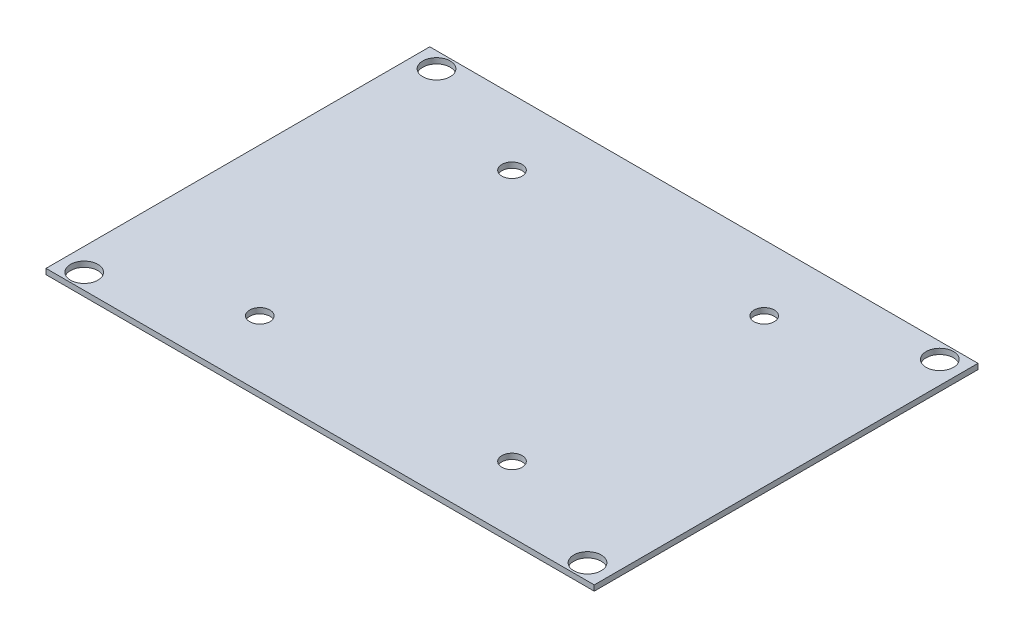
ISO-10303-21;
HEADER;
FILE_DESCRIPTION(('STEP AP214'),'2;1');
FILE_NAME('part.step','',(''),(''),'','','');
FILE_SCHEMA(('AUTOMOTIVE_DESIGN { 1 0 10303 214 1 1 1 1 }'));
ENDSEC;
DATA;
#1=APPLICATION_CONTEXT('core data for automotive mechanical design processes');
#2=APPLICATION_PROTOCOL_DEFINITION('international standard','automotive_design',2000,#1);
#3=PRODUCT_CONTEXT('',#1,'mechanical');
#4=PRODUCT('Part','Part','',(#3));
#5=PRODUCT_RELATED_PRODUCT_CATEGORY('part','',(#4));
#6=PRODUCT_DEFINITION_FORMATION('','',#4);
#7=PRODUCT_DEFINITION_CONTEXT('part definition',#1,'design');
#8=PRODUCT_DEFINITION('design','',#6,#7);
#9=PRODUCT_DEFINITION_SHAPE('','',#8);
#10=(LENGTH_UNIT() NAMED_UNIT(*) SI_UNIT(.MILLI.,.METRE.));
#11=(NAMED_UNIT(*) PLANE_ANGLE_UNIT() SI_UNIT($,.RADIAN.));
#12=(NAMED_UNIT(*) SI_UNIT($,.STERADIAN.) SOLID_ANGLE_UNIT());
#13=UNCERTAINTY_MEASURE_WITH_UNIT(LENGTH_MEASURE(1.E-05),#10,'distance_accuracy_value','');
#14=(GEOMETRIC_REPRESENTATION_CONTEXT(3) GLOBAL_UNCERTAINTY_ASSIGNED_CONTEXT((#13)) GLOBAL_UNIT_ASSIGNED_CONTEXT((#10,
#11,#12)) REPRESENTATION_CONTEXT('',''));
#15=CARTESIAN_POINT('',(0.,0.,0.));
#16=DIRECTION('',(0.,0.,1.));
#17=DIRECTION('',(1.,0.,0.));
#18=AXIS2_PLACEMENT_3D('',#15,#16,#17);
#19=CARTESIAN_POINT('',(0.,1.,0.));
#20=DIRECTION('',(0.,1.,0.));
#21=DIRECTION('',(0.,0.,1.));
#22=AXIS2_PLACEMENT_3D('',#19,#20,#21);
#23=PLANE('',#22);
#24=CARTESIAN_POINT('',(45.9038403974048,1.,32.1326882781834));
#25=DIRECTION('',(0.,1.,0.));
#26=DIRECTION('',(0.,0.,1.));
#27=AXIS2_PLACEMENT_3D('',#24,#25,#26);
#28=CIRCLE('',#27,2.5);
#29=CARTESIAN_POINT('',(45.9038403974048,1.,34.6326882781834));
#30=VERTEX_POINT('',#29);
#31=EDGE_CURVE('E174',#30,#30,#28,.T.);
#32=ORIENTED_EDGE('',*,*,#31,.F.);
#33=EDGE_LOOP('',(#32));
#34=FACE_BOUND('',#33,.T.);
#35=CARTESIAN_POINT('',(-45.9038403974048,1.,-32.1326882781834));
#36=DIRECTION('',(0.,1.,0.));
#37=DIRECTION('',(0.,0.,1.));
#38=AXIS2_PLACEMENT_3D('',#35,#36,#37);
#39=CIRCLE('',#38,2.5);
#40=CARTESIAN_POINT('',(-45.9038403974048,1.,-29.6326882781834));
#41=VERTEX_POINT('',#40);
#42=EDGE_CURVE('E158',#41,#41,#39,.T.);
#43=ORIENTED_EDGE('',*,*,#42,.F.);
#44=EDGE_LOOP('',(#43));
#45=FACE_BOUND('',#44,.T.);
#46=CARTESIAN_POINT('',(23.,1.,23.));
#47=DIRECTION('',(0.,1.,0.));
#48=DIRECTION('',(0.,0.,1.));
#49=AXIS2_PLACEMENT_3D('',#46,#47,#48);
#50=CIRCLE('',#49,1.85);
#51=CARTESIAN_POINT('',(23.,1.,24.85));
#52=VERTEX_POINT('',#51);
#53=EDGE_CURVE('E142',#52,#52,#50,.T.);
#54=ORIENTED_EDGE('',*,*,#53,.F.);
#55=EDGE_LOOP('',(#54));
#56=FACE_BOUND('',#55,.T.);
#57=CARTESIAN_POINT('',(-23.,1.,-23.));
#58=DIRECTION('',(0.,1.,0.));
#59=DIRECTION('',(0.,0.,1.));
#60=AXIS2_PLACEMENT_3D('',#57,#58,#59);
#61=CIRCLE('',#60,1.85);
#62=CARTESIAN_POINT('',(-23.,1.,-21.15));
#63=VERTEX_POINT('',#62);
#64=EDGE_CURVE('E112',#63,#63,#61,.T.);
#65=ORIENTED_EDGE('',*,*,#64,.F.);
#66=EDGE_LOOP('',(#65));
#67=FACE_BOUND('',#66,.T.);
#68=DIRECTION('',(0.,0.,-1.));
#69=VECTOR('',#68,1.);
#70=CARTESIAN_POINT('',(50.,1.,-35.));
#71=LINE('',#70,#69);
#72=CARTESIAN_POINT('',(50.,1.,35.));
#73=VERTEX_POINT('',#72);
#74=CARTESIAN_POINT('',(50.,1.,-35.));
#75=VERTEX_POINT('',#74);
#76=EDGE_CURVE('E92',#73,#75,#71,.T.);
#77=ORIENTED_EDGE('',*,*,#76,.T.);
#78=DIRECTION('',(-1.,0.,0.));
#79=VECTOR('',#78,1.);
#80=CARTESIAN_POINT('',(-50.,1.,-35.));
#81=LINE('',#80,#79);
#82=CARTESIAN_POINT('',(-50.,1.,-35.));
#83=VERTEX_POINT('',#82);
#84=EDGE_CURVE('E87',#75,#83,#81,.T.);
#85=ORIENTED_EDGE('',*,*,#84,.T.);
#86=DIRECTION('',(0.,0.,1.));
#87=VECTOR('',#86,1.);
#88=CARTESIAN_POINT('',(-50.,1.,-35.));
#89=LINE('',#88,#87);
#90=CARTESIAN_POINT('',(-50.,1.,35.));
#91=VERTEX_POINT('',#90);
#92=EDGE_CURVE('E90',#83,#91,#89,.T.);
#93=ORIENTED_EDGE('',*,*,#92,.T.);
#94=DIRECTION('',(1.,0.,0.));
#95=VECTOR('',#94,1.);
#96=CARTESIAN_POINT('',(-50.,1.,35.));
#97=LINE('',#96,#95);
#98=EDGE_CURVE('E57',#91,#73,#97,.T.);
#99=ORIENTED_EDGE('',*,*,#98,.T.);
#100=EDGE_LOOP('',(#77,#85,#93,#99));
#101=FACE_BOUND('',#100,.T.);
#102=CARTESIAN_POINT('',(-23.,1.,23.));
#103=DIRECTION('',(0.,1.,0.));
#104=DIRECTION('',(0.,0.,1.));
#105=AXIS2_PLACEMENT_3D('',#102,#103,#104);
#106=CIRCLE('',#105,1.85);
#107=CARTESIAN_POINT('',(-23.,1.,24.85));
#108=VERTEX_POINT('',#107);
#109=EDGE_CURVE('E134',#108,#108,#106,.T.);
#110=ORIENTED_EDGE('',*,*,#109,.F.);
#111=EDGE_LOOP('',(#110));
#112=FACE_BOUND('',#111,.T.);
#113=CARTESIAN_POINT('',(23.,1.,-23.));
#114=DIRECTION('',(0.,1.,0.));
#115=DIRECTION('',(0.,0.,1.));
#116=AXIS2_PLACEMENT_3D('',#113,#114,#115);
#117=CIRCLE('',#116,1.85);
#118=CARTESIAN_POINT('',(23.,1.,-21.15));
#119=VERTEX_POINT('',#118);
#120=EDGE_CURVE('E150',#119,#119,#117,.T.);
#121=ORIENTED_EDGE('',*,*,#120,.F.);
#122=EDGE_LOOP('',(#121));
#123=FACE_BOUND('',#122,.T.);
#124=CARTESIAN_POINT('',(45.9038403974048,1.,-32.1326882781834));
#125=DIRECTION('',(0.,1.,0.));
#126=DIRECTION('',(0.,0.,1.));
#127=AXIS2_PLACEMENT_3D('',#124,#125,#126);
#128=CIRCLE('',#127,2.5);
#129=CARTESIAN_POINT('',(45.9038403974048,1.,-29.6326882781834));
#130=VERTEX_POINT('',#129);
#131=EDGE_CURVE('E166',#130,#130,#128,.T.);
#132=ORIENTED_EDGE('',*,*,#131,.F.);
#133=EDGE_LOOP('',(#132));
#134=FACE_BOUND('',#133,.T.);
#135=CARTESIAN_POINT('',(-45.9038403974048,1.,32.1326882781834));
#136=DIRECTION('',(0.,1.,0.));
#137=DIRECTION('',(0.,0.,1.));
#138=AXIS2_PLACEMENT_3D('',#135,#136,#137);
#139=CIRCLE('',#138,2.5);
#140=CARTESIAN_POINT('',(-45.9038403974048,1.,34.6326882781834));
#141=VERTEX_POINT('',#140);
#142=EDGE_CURVE('E182',#141,#141,#139,.T.);
#143=ORIENTED_EDGE('',*,*,#142,.F.);
#144=EDGE_LOOP('',(#143));
#145=FACE_BOUND('',#144,.T.);
#146=ADVANCED_FACE('F39',(#34,#45,#56,#67,#101,#112,#123,#134,#145),#23,.T.);
#147=CARTESIAN_POINT('',(0.,0.,0.));
#148=DIRECTION('',(0.,1.,0.));
#149=DIRECTION('',(0.,0.,1.));
#150=AXIS2_PLACEMENT_3D('',#147,#148,#149);
#151=PLANE('',#150);
#152=DIRECTION('',(0.,0.,-1.));
#153=VECTOR('',#152,1.);
#154=CARTESIAN_POINT('',(50.,0.,-35.));
#155=LINE('',#154,#153);
#156=CARTESIAN_POINT('',(50.,0.,35.));
#157=VERTEX_POINT('',#156);
#158=CARTESIAN_POINT('',(50.,0.,-35.));
#159=VERTEX_POINT('',#158);
#160=EDGE_CURVE('E108',#157,#159,#155,.T.);
#161=ORIENTED_EDGE('',*,*,#160,.F.);
#162=DIRECTION('',(1.,0.,0.));
#163=VECTOR('',#162,1.);
#164=CARTESIAN_POINT('',(-50.,0.,35.));
#165=LINE('',#164,#163);
#166=CARTESIAN_POINT('',(-50.,0.,35.));
#167=VERTEX_POINT('',#166);
#168=EDGE_CURVE('E80',#167,#157,#165,.T.);
#169=ORIENTED_EDGE('',*,*,#168,.F.);
#170=DIRECTION('',(0.,0.,1.));
#171=VECTOR('',#170,1.);
#172=CARTESIAN_POINT('',(-50.,0.,-35.));
#173=LINE('',#172,#171);
#174=CARTESIAN_POINT('',(-50.,0.,-35.));
#175=VERTEX_POINT('',#174);
#176=EDGE_CURVE('E74',#175,#167,#173,.T.);
#177=ORIENTED_EDGE('',*,*,#176,.F.);
#178=DIRECTION('',(-1.,0.,0.));
#179=VECTOR('',#178,1.);
#180=CARTESIAN_POINT('',(-50.,0.,-35.));
#181=LINE('',#180,#179);
#182=EDGE_CURVE('E97',#159,#175,#181,.T.);
#183=ORIENTED_EDGE('',*,*,#182,.F.);
#184=EDGE_LOOP('',(#161,#169,#177,#183));
#185=FACE_BOUND('',#184,.T.);
#186=CARTESIAN_POINT('',(-23.,0.,-23.));
#187=DIRECTION('',(0.,1.,0.));
#188=DIRECTION('',(0.,0.,1.));
#189=AXIS2_PLACEMENT_3D('',#186,#187,#188);
#190=CIRCLE('',#189,1.85);
#191=CARTESIAN_POINT('',(-23.,0.,-21.15));
#192=VERTEX_POINT('',#191);
#193=EDGE_CURVE('E130',#192,#192,#190,.T.);
#194=ORIENTED_EDGE('',*,*,#193,.T.);
#195=EDGE_LOOP('',(#194));
#196=FACE_BOUND('',#195,.T.);
#197=CARTESIAN_POINT('',(-23.,0.,23.));
#198=DIRECTION('',(0.,1.,0.));
#199=DIRECTION('',(0.,0.,1.));
#200=AXIS2_PLACEMENT_3D('',#197,#198,#199);
#201=CIRCLE('',#200,1.85);
#202=CARTESIAN_POINT('',(-23.,0.,24.85));
#203=VERTEX_POINT('',#202);
#204=EDGE_CURVE('E138',#203,#203,#201,.T.);
#205=ORIENTED_EDGE('',*,*,#204,.T.);
#206=EDGE_LOOP('',(#205));
#207=FACE_BOUND('',#206,.T.);
#208=CARTESIAN_POINT('',(23.,0.,23.));
#209=DIRECTION('',(0.,1.,0.));
#210=DIRECTION('',(0.,0.,1.));
#211=AXIS2_PLACEMENT_3D('',#208,#209,#210);
#212=CIRCLE('',#211,1.85);
#213=CARTESIAN_POINT('',(23.,0.,24.85));
#214=VERTEX_POINT('',#213);
#215=EDGE_CURVE('E146',#214,#214,#212,.T.);
#216=ORIENTED_EDGE('',*,*,#215,.T.);
#217=EDGE_LOOP('',(#216));
#218=FACE_BOUND('',#217,.T.);
#219=CARTESIAN_POINT('',(23.,0.,-23.));
#220=DIRECTION('',(0.,1.,0.));
#221=DIRECTION('',(0.,0.,1.));
#222=AXIS2_PLACEMENT_3D('',#219,#220,#221);
#223=CIRCLE('',#222,1.85);
#224=CARTESIAN_POINT('',(23.,0.,-21.15));
#225=VERTEX_POINT('',#224);
#226=EDGE_CURVE('E154',#225,#225,#223,.T.);
#227=ORIENTED_EDGE('',*,*,#226,.T.);
#228=EDGE_LOOP('',(#227));
#229=FACE_BOUND('',#228,.T.);
#230=CARTESIAN_POINT('',(-45.9038403974048,0.,-32.1326882781834));
#231=DIRECTION('',(0.,1.,0.));
#232=DIRECTION('',(0.,0.,1.));
#233=AXIS2_PLACEMENT_3D('',#230,#231,#232);
#234=CIRCLE('',#233,2.5);
#235=CARTESIAN_POINT('',(-45.9038403974048,0.,-29.6326882781834));
#236=VERTEX_POINT('',#235);
#237=EDGE_CURVE('E162',#236,#236,#234,.T.);
#238=ORIENTED_EDGE('',*,*,#237,.T.);
#239=EDGE_LOOP('',(#238));
#240=FACE_BOUND('',#239,.T.);
#241=CARTESIAN_POINT('',(45.9038403974048,0.,-32.1326882781834));
#242=DIRECTION('',(0.,1.,0.));
#243=DIRECTION('',(0.,0.,1.));
#244=AXIS2_PLACEMENT_3D('',#241,#242,#243);
#245=CIRCLE('',#244,2.5);
#246=CARTESIAN_POINT('',(45.9038403974048,0.,-29.6326882781834));
#247=VERTEX_POINT('',#246);
#248=EDGE_CURVE('E170',#247,#247,#245,.T.);
#249=ORIENTED_EDGE('',*,*,#248,.T.);
#250=EDGE_LOOP('',(#249));
#251=FACE_BOUND('',#250,.T.);
#252=CARTESIAN_POINT('',(45.9038403974048,0.,32.1326882781834));
#253=DIRECTION('',(0.,1.,0.));
#254=DIRECTION('',(0.,0.,1.));
#255=AXIS2_PLACEMENT_3D('',#252,#253,#254);
#256=CIRCLE('',#255,2.5);
#257=CARTESIAN_POINT('',(45.9038403974048,0.,34.6326882781834));
#258=VERTEX_POINT('',#257);
#259=EDGE_CURVE('E178',#258,#258,#256,.T.);
#260=ORIENTED_EDGE('',*,*,#259,.T.);
#261=EDGE_LOOP('',(#260));
#262=FACE_BOUND('',#261,.T.);
#263=CARTESIAN_POINT('',(-45.9038403974048,0.,32.1326882781834));
#264=DIRECTION('',(0.,1.,0.));
#265=DIRECTION('',(0.,0.,1.));
#266=AXIS2_PLACEMENT_3D('',#263,#264,#265);
#267=CIRCLE('',#266,2.5);
#268=CARTESIAN_POINT('',(-45.9038403974048,0.,34.6326882781834));
#269=VERTEX_POINT('',#268);
#270=EDGE_CURVE('E186',#269,#269,#267,.T.);
#271=ORIENTED_EDGE('',*,*,#270,.T.);
#272=EDGE_LOOP('',(#271));
#273=FACE_BOUND('',#272,.T.);
#274=ADVANCED_FACE('F125',(#185,#196,#207,#218,#229,#240,#251,#262,#273),#151,.F.);
#275=CARTESIAN_POINT('',(50.,1.,-35.));
#276=DIRECTION('',(-1.,0.,0.));
#277=DIRECTION('',(0.,0.,1.));
#278=AXIS2_PLACEMENT_3D('',#275,#276,#277);
#279=PLANE('',#278);
#280=ORIENTED_EDGE('',*,*,#160,.T.);
#281=DIRECTION('',(0.,-1.,0.));
#282=VECTOR('',#281,1.);
#283=CARTESIAN_POINT('',(50.,1.,-35.));
#284=LINE('',#283,#282);
#285=EDGE_CURVE('E11',#75,#159,#284,.T.);
#286=ORIENTED_EDGE('',*,*,#285,.F.);
#287=ORIENTED_EDGE('',*,*,#76,.F.);
#288=DIRECTION('',(0.,-1.,0.));
#289=VECTOR('',#288,1.);
#290=CARTESIAN_POINT('',(50.,1.,35.));
#291=LINE('',#290,#289);
#292=EDGE_CURVE('E104',#73,#157,#291,.T.);
#293=ORIENTED_EDGE('',*,*,#292,.T.);
#294=EDGE_LOOP('',(#280,#286,#287,#293));
#295=FACE_BOUND('',#294,.T.);
#296=ADVANCED_FACE('F41',(#295),#279,.F.);
#297=CARTESIAN_POINT('',(-50.,1.,-35.));
#298=DIRECTION('',(0.,0.,1.));
#299=DIRECTION('',(1.,0.,0.));
#300=AXIS2_PLACEMENT_3D('',#297,#298,#299);
#301=PLANE('',#300);
#302=ORIENTED_EDGE('',*,*,#182,.T.);
#303=DIRECTION('',(0.,-1.,0.));
#304=VECTOR('',#303,1.);
#305=CARTESIAN_POINT('',(-50.,1.,-35.));
#306=LINE('',#305,#304);
#307=EDGE_CURVE('E49',#83,#175,#306,.T.);
#308=ORIENTED_EDGE('',*,*,#307,.F.);
#309=ORIENTED_EDGE('',*,*,#84,.F.);
#310=ORIENTED_EDGE('',*,*,#285,.T.);
#311=EDGE_LOOP('',(#302,#308,#309,#310));
#312=FACE_BOUND('',#311,.T.);
#313=ADVANCED_FACE('F96',(#312),#301,.F.);
#314=CARTESIAN_POINT('',(-50.,1.,-35.));
#315=DIRECTION('',(1.,0.,0.));
#316=DIRECTION('',(0.,0.,-1.));
#317=AXIS2_PLACEMENT_3D('',#314,#315,#316);
#318=PLANE('',#317);
#319=ORIENTED_EDGE('',*,*,#176,.T.);
#320=DIRECTION('',(0.,-1.,0.));
#321=VECTOR('',#320,1.);
#322=CARTESIAN_POINT('',(-50.,1.,35.));
#323=LINE('',#322,#321);
#324=EDGE_CURVE('E99',#91,#167,#323,.T.);
#325=ORIENTED_EDGE('',*,*,#324,.F.);
#326=ORIENTED_EDGE('',*,*,#92,.F.);
#327=ORIENTED_EDGE('',*,*,#307,.T.);
#328=EDGE_LOOP('',(#319,#325,#326,#327));
#329=FACE_BOUND('',#328,.T.);
#330=ADVANCED_FACE('F100',(#329),#318,.F.);
#331=CARTESIAN_POINT('',(-50.,1.,35.));
#332=DIRECTION('',(0.,0.,-1.));
#333=DIRECTION('',(-1.,0.,0.));
#334=AXIS2_PLACEMENT_3D('',#331,#332,#333);
#335=PLANE('',#334);
#336=ORIENTED_EDGE('',*,*,#168,.T.);
#337=ORIENTED_EDGE('',*,*,#292,.F.);
#338=ORIENTED_EDGE('',*,*,#98,.F.);
#339=ORIENTED_EDGE('',*,*,#324,.T.);
#340=EDGE_LOOP('',(#336,#337,#338,#339));
#341=FACE_BOUND('',#340,.T.);
#342=ADVANCED_FACE('F122',(#341),#335,.F.);
#343=CARTESIAN_POINT('',(-23.,1.,-23.));
#344=DIRECTION('',(0.,-1.,0.));
#345=DIRECTION('',(0.,0.,-1.));
#346=AXIS2_PLACEMENT_3D('',#343,#344,#345);
#347=CYLINDRICAL_SURFACE('',#346,1.85);
#348=ORIENTED_EDGE('',*,*,#64,.T.);
#349=EDGE_LOOP('',(#348));
#350=FACE_BOUND('',#349,.T.);
#351=ORIENTED_EDGE('',*,*,#193,.F.);
#352=EDGE_LOOP('',(#351));
#353=FACE_BOUND('',#352,.T.);
#354=ADVANCED_FACE('F207',(#350,#353),#347,.F.);
#355=CARTESIAN_POINT('',(-23.,1.,23.));
#356=DIRECTION('',(0.,-1.,0.));
#357=DIRECTION('',(0.,0.,-1.));
#358=AXIS2_PLACEMENT_3D('',#355,#356,#357);
#359=CYLINDRICAL_SURFACE('',#358,1.85);
#360=ORIENTED_EDGE('',*,*,#109,.T.);
#361=EDGE_LOOP('',(#360));
#362=FACE_BOUND('',#361,.T.);
#363=ORIENTED_EDGE('',*,*,#204,.F.);
#364=EDGE_LOOP('',(#363));
#365=FACE_BOUND('',#364,.T.);
#366=ADVANCED_FACE('F253',(#362,#365),#359,.F.);
#367=CARTESIAN_POINT('',(23.,1.,23.));
#368=DIRECTION('',(0.,-1.,0.));
#369=DIRECTION('',(0.,0.,-1.));
#370=AXIS2_PLACEMENT_3D('',#367,#368,#369);
#371=CYLINDRICAL_SURFACE('',#370,1.85);
#372=ORIENTED_EDGE('',*,*,#53,.T.);
#373=EDGE_LOOP('',(#372));
#374=FACE_BOUND('',#373,.T.);
#375=ORIENTED_EDGE('',*,*,#215,.F.);
#376=EDGE_LOOP('',(#375));
#377=FACE_BOUND('',#376,.T.);
#378=ADVANCED_FACE('F261',(#374,#377),#371,.F.);
#379=CARTESIAN_POINT('',(23.,1.,-23.));
#380=DIRECTION('',(0.,-1.,0.));
#381=DIRECTION('',(0.,0.,-1.));
#382=AXIS2_PLACEMENT_3D('',#379,#380,#381);
#383=CYLINDRICAL_SURFACE('',#382,1.85);
#384=ORIENTED_EDGE('',*,*,#120,.T.);
#385=EDGE_LOOP('',(#384));
#386=FACE_BOUND('',#385,.T.);
#387=ORIENTED_EDGE('',*,*,#226,.F.);
#388=EDGE_LOOP('',(#387));
#389=FACE_BOUND('',#388,.T.);
#390=ADVANCED_FACE('F269',(#386,#389),#383,.F.);
#391=CARTESIAN_POINT('',(-45.9038403974048,1.,-32.1326882781834));
#392=DIRECTION('',(0.,-1.,0.));
#393=DIRECTION('',(0.,0.,-1.));
#394=AXIS2_PLACEMENT_3D('',#391,#392,#393);
#395=CYLINDRICAL_SURFACE('',#394,2.5);
#396=ORIENTED_EDGE('',*,*,#42,.T.);
#397=EDGE_LOOP('',(#396));
#398=FACE_BOUND('',#397,.T.);
#399=ORIENTED_EDGE('',*,*,#237,.F.);
#400=EDGE_LOOP('',(#399));
#401=FACE_BOUND('',#400,.T.);
#402=ADVANCED_FACE('F278',(#398,#401),#395,.F.);
#403=CARTESIAN_POINT('',(45.9038403974048,1.,-32.1326882781834));
#404=DIRECTION('',(0.,-1.,0.));
#405=DIRECTION('',(0.,0.,-1.));
#406=AXIS2_PLACEMENT_3D('',#403,#404,#405);
#407=CYLINDRICAL_SURFACE('',#406,2.5);
#408=ORIENTED_EDGE('',*,*,#131,.T.);
#409=EDGE_LOOP('',(#408));
#410=FACE_BOUND('',#409,.T.);
#411=ORIENTED_EDGE('',*,*,#248,.F.);
#412=EDGE_LOOP('',(#411));
#413=FACE_BOUND('',#412,.T.);
#414=ADVANCED_FACE('F287',(#410,#413),#407,.F.);
#415=CARTESIAN_POINT('',(45.9038403974048,1.,32.1326882781834));
#416=DIRECTION('',(0.,-1.,0.));
#417=DIRECTION('',(0.,0.,-1.));
#418=AXIS2_PLACEMENT_3D('',#415,#416,#417);
#419=CYLINDRICAL_SURFACE('',#418,2.5);
#420=ORIENTED_EDGE('',*,*,#31,.T.);
#421=EDGE_LOOP('',(#420));
#422=FACE_BOUND('',#421,.T.);
#423=ORIENTED_EDGE('',*,*,#259,.F.);
#424=EDGE_LOOP('',(#423));
#425=FACE_BOUND('',#424,.T.);
#426=ADVANCED_FACE('F296',(#422,#425),#419,.F.);
#427=CARTESIAN_POINT('',(-45.9038403974048,1.,32.1326882781834));
#428=DIRECTION('',(0.,-1.,0.));
#429=DIRECTION('',(0.,0.,-1.));
#430=AXIS2_PLACEMENT_3D('',#427,#428,#429);
#431=CYLINDRICAL_SURFACE('',#430,2.5);
#432=ORIENTED_EDGE('',*,*,#142,.T.);
#433=EDGE_LOOP('',(#432));
#434=FACE_BOUND('',#433,.T.);
#435=ORIENTED_EDGE('',*,*,#270,.F.);
#436=EDGE_LOOP('',(#435));
#437=FACE_BOUND('',#436,.T.);
#438=ADVANCED_FACE('F194',(#434,#437),#431,.F.);
#439=CLOSED_SHELL('',(#146,#274,#296,#313,#330,#342,#354,#366,#378,#390,#402,#414,#426,#438));
#440=MANIFOLD_SOLID_BREP('B2',#439);
#441=ADVANCED_BREP_SHAPE_REPRESENTATION('',(#18,#440),#14);
#442=SHAPE_DEFINITION_REPRESENTATION(#9,#441);
ENDSEC;
END-ISO-10303-21;
